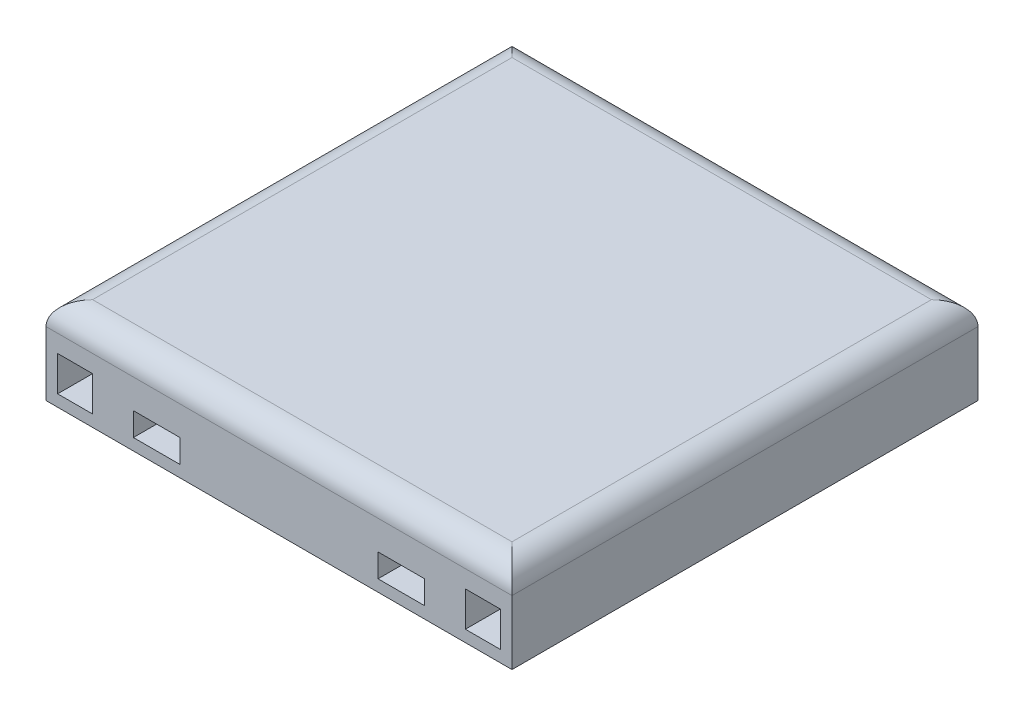
ISO-10303-21;
HEADER;
FILE_DESCRIPTION(('STEP AP214'),'2;1');
FILE_NAME('part.step','',(''),(''),'','','');
FILE_SCHEMA(('AUTOMOTIVE_DESIGN { 1 0 10303 214 1 1 1 1 }'));
ENDSEC;
DATA;
#1=APPLICATION_CONTEXT('core data for automotive mechanical design processes');
#2=APPLICATION_PROTOCOL_DEFINITION('international standard','automotive_design',2000,#1);
#3=PRODUCT_CONTEXT('',#1,'mechanical');
#4=PRODUCT('Part','Part','',(#3));
#5=PRODUCT_RELATED_PRODUCT_CATEGORY('part','',(#4));
#6=PRODUCT_DEFINITION_FORMATION('','',#4);
#7=PRODUCT_DEFINITION_CONTEXT('part definition',#1,'design');
#8=PRODUCT_DEFINITION('design','',#6,#7);
#9=PRODUCT_DEFINITION_SHAPE('','',#8);
#10=(LENGTH_UNIT() NAMED_UNIT(*) SI_UNIT(.MILLI.,.METRE.));
#11=(NAMED_UNIT(*) PLANE_ANGLE_UNIT() SI_UNIT($,.RADIAN.));
#12=(NAMED_UNIT(*) SI_UNIT($,.STERADIAN.) SOLID_ANGLE_UNIT());
#13=UNCERTAINTY_MEASURE_WITH_UNIT(LENGTH_MEASURE(1.E-05),#10,'distance_accuracy_value','');
#14=(GEOMETRIC_REPRESENTATION_CONTEXT(3) GLOBAL_UNCERTAINTY_ASSIGNED_CONTEXT((#13)) GLOBAL_UNIT_ASSIGNED_CONTEXT((#10,
#11,#12)) REPRESENTATION_CONTEXT('',''));
#15=CARTESIAN_POINT('',(0.,0.,0.));
#16=DIRECTION('',(0.,0.,1.));
#17=DIRECTION('',(1.,0.,0.));
#18=AXIS2_PLACEMENT_3D('',#15,#16,#17);
#19=CARTESIAN_POINT('',(40.,7.5,40.));
#20=DIRECTION('',(-1.,0.,0.));
#21=DIRECTION('',(0.,0.,1.));
#22=AXIS2_PLACEMENT_3D('',#19,#20,#21);
#23=PLANE('',#22);
#24=DIRECTION('',(0.,-1.,0.));
#25=VECTOR('',#24,1.);
#26=CARTESIAN_POINT('',(40.,7.5,-40.));
#27=LINE('',#26,#25);
#28=CARTESIAN_POINT('',(40.,3.5,-40.));
#29=VERTEX_POINT('',#28);
#30=CARTESIAN_POINT('',(40.,-7.5,-40.));
#31=VERTEX_POINT('',#30);
#32=EDGE_CURVE('E335',#29,#31,#27,.T.);
#33=ORIENTED_EDGE('',*,*,#32,.F.);
#34=DIRECTION('',(0.,0.,-1.));
#35=VECTOR('',#34,1.);
#36=CARTESIAN_POINT('',(40.,3.5,40.));
#37=LINE('',#36,#35);
#38=CARTESIAN_POINT('',(40.,3.5,40.));
#39=VERTEX_POINT('',#38);
#40=EDGE_CURVE('E11',#29,#39,#37,.F.);
#41=ORIENTED_EDGE('',*,*,#40,.T.);
#42=DIRECTION('',(0.,-1.,0.));
#43=VECTOR('',#42,1.);
#44=CARTESIAN_POINT('',(40.,7.5,40.));
#45=LINE('',#44,#43);
#46=CARTESIAN_POINT('',(40.,-7.5,40.));
#47=VERTEX_POINT('',#46);
#48=EDGE_CURVE('E329',#39,#47,#45,.T.);
#49=ORIENTED_EDGE('',*,*,#48,.T.);
#50=DIRECTION('',(0.,0.,-1.));
#51=VECTOR('',#50,1.);
#52=CARTESIAN_POINT('',(40.,-7.5,40.));
#53=LINE('',#52,#51);
#54=EDGE_CURVE('E317',#47,#31,#53,.T.);
#55=ORIENTED_EDGE('',*,*,#54,.T.);
#56=EDGE_LOOP('',(#33,#41,#49,#55));
#57=FACE_BOUND('',#56,.T.);
#58=ADVANCED_FACE('F34',(#57),#23,.F.);
#59=CARTESIAN_POINT('',(-40.,7.5,-40.));
#60=DIRECTION('',(0.,0.,1.));
#61=DIRECTION('',(1.,0.,0.));
#62=AXIS2_PLACEMENT_3D('',#59,#60,#61);
#63=PLANE('',#62);
#64=DIRECTION('',(0.,-1.,0.));
#65=VECTOR('',#64,1.);
#66=CARTESIAN_POINT('',(-40.,7.5,-40.));
#67=LINE('',#66,#65);
#68=CARTESIAN_POINT('',(-40.,3.5,-40.));
#69=VERTEX_POINT('',#68);
#70=CARTESIAN_POINT('',(-40.,-7.5,-40.));
#71=VERTEX_POINT('',#70);
#72=EDGE_CURVE('E333',#69,#71,#67,.T.);
#73=ORIENTED_EDGE('',*,*,#72,.F.);
#74=DIRECTION('',(-1.,0.,0.));
#75=VECTOR('',#74,1.);
#76=CARTESIAN_POINT('',(-40.,3.5,-40.));
#77=LINE('',#76,#75);
#78=EDGE_CURVE('E43',#69,#29,#77,.F.);
#79=ORIENTED_EDGE('',*,*,#78,.T.);
#80=ORIENTED_EDGE('',*,*,#32,.T.);
#81=DIRECTION('',(-1.,0.,0.));
#82=VECTOR('',#81,1.);
#83=CARTESIAN_POINT('',(-40.,-7.5,-40.));
#84=LINE('',#83,#82);
#85=EDGE_CURVE('E320',#31,#71,#84,.T.);
#86=ORIENTED_EDGE('',*,*,#85,.T.);
#87=EDGE_LOOP('',(#73,#79,#80,#86));
#88=FACE_BOUND('',#87,.T.);
#89=ADVANCED_FACE('F373',(#88),#63,.F.);
#90=CARTESIAN_POINT('',(-40.,7.5,40.));
#91=DIRECTION('',(1.,0.,0.));
#92=DIRECTION('',(0.,0.,-1.));
#93=AXIS2_PLACEMENT_3D('',#90,#91,#92);
#94=PLANE('',#93);
#95=DIRECTION('',(0.,-1.,0.));
#96=VECTOR('',#95,1.);
#97=CARTESIAN_POINT('',(-40.,7.5,40.));
#98=LINE('',#97,#96);
#99=CARTESIAN_POINT('',(-40.,3.5,40.));
#100=VERTEX_POINT('',#99);
#101=CARTESIAN_POINT('',(-40.,-7.5,40.));
#102=VERTEX_POINT('',#101);
#103=EDGE_CURVE('E331',#100,#102,#98,.T.);
#104=ORIENTED_EDGE('',*,*,#103,.F.);
#105=DIRECTION('',(0.,0.,1.));
#106=VECTOR('',#105,1.);
#107=CARTESIAN_POINT('',(-40.,3.5,40.));
#108=LINE('',#107,#106);
#109=EDGE_CURVE('E349',#100,#69,#108,.F.);
#110=ORIENTED_EDGE('',*,*,#109,.T.);
#111=ORIENTED_EDGE('',*,*,#72,.T.);
#112=DIRECTION('',(0.,0.,1.));
#113=VECTOR('',#112,1.);
#114=CARTESIAN_POINT('',(-40.,-7.5,40.));
#115=LINE('',#114,#113);
#116=EDGE_CURVE('E323',#71,#102,#115,.T.);
#117=ORIENTED_EDGE('',*,*,#116,.T.);
#118=EDGE_LOOP('',(#104,#110,#111,#117));
#119=FACE_BOUND('',#118,.T.);
#120=ADVANCED_FACE('F384',(#119),#94,.F.);
#121=CARTESIAN_POINT('',(-40.,7.5,40.));
#122=DIRECTION('',(0.,0.,-1.));
#123=DIRECTION('',(-1.,0.,0.));
#124=AXIS2_PLACEMENT_3D('',#121,#122,#123);
#125=PLANE('',#124);
#126=DIRECTION('',(1.,0.,0.));
#127=VECTOR('',#126,1.);
#128=CARTESIAN_POINT('',(-25.,-5.5,40.));
#129=LINE('',#128,#127);
#130=CARTESIAN_POINT('',(-25.,-5.5,40.));
#131=VERTEX_POINT('',#130);
#132=CARTESIAN_POINT('',(-17.,-5.5,40.));
#133=VERTEX_POINT('',#132);
#134=EDGE_CURVE('E213',#131,#133,#129,.T.);
#135=ORIENTED_EDGE('',*,*,#134,.F.);
#136=DIRECTION('',(0.,-1.,0.));
#137=VECTOR('',#136,1.);
#138=CARTESIAN_POINT('',(-25.,-1.5,40.));
#139=LINE('',#138,#137);
#140=CARTESIAN_POINT('',(-25.,-1.5,40.));
#141=VERTEX_POINT('',#140);
#142=EDGE_CURVE('E51',#141,#131,#139,.T.);
#143=ORIENTED_EDGE('',*,*,#142,.F.);
#144=DIRECTION('',(-1.,0.,0.));
#145=VECTOR('',#144,1.);
#146=CARTESIAN_POINT('',(-25.,-1.5,40.));
#147=LINE('',#146,#145);
#148=CARTESIAN_POINT('',(-17.,-1.5,40.));
#149=VERTEX_POINT('',#148);
#150=EDGE_CURVE('E204',#149,#141,#147,.T.);
#151=ORIENTED_EDGE('',*,*,#150,.F.);
#152=DIRECTION('',(0.,1.,0.));
#153=VECTOR('',#152,1.);
#154=CARTESIAN_POINT('',(-17.,-1.5,40.));
#155=LINE('',#154,#153);
#156=EDGE_CURVE('E207',#133,#149,#155,.T.);
#157=ORIENTED_EDGE('',*,*,#156,.F.);
#158=EDGE_LOOP('',(#135,#143,#151,#157));
#159=FACE_BOUND('',#158,.T.);
#160=DIRECTION('',(0.,-1.,0.));
#161=VECTOR('',#160,1.);
#162=CARTESIAN_POINT('',(17.,-1.5,40.));
#163=LINE('',#162,#161);
#164=CARTESIAN_POINT('',(17.,-1.5,40.));
#165=VERTEX_POINT('',#164);
#166=CARTESIAN_POINT('',(17.,-5.5,40.));
#167=VERTEX_POINT('',#166);
#168=EDGE_CURVE('E239',#165,#167,#163,.T.);
#169=ORIENTED_EDGE('',*,*,#168,.F.);
#170=DIRECTION('',(-1.,0.,0.));
#171=VECTOR('',#170,1.);
#172=CARTESIAN_POINT('',(25.,-1.5,40.));
#173=LINE('',#172,#171);
#174=CARTESIAN_POINT('',(25.,-1.5,40.));
#175=VERTEX_POINT('',#174);
#176=EDGE_CURVE('E59',#175,#165,#173,.T.);
#177=ORIENTED_EDGE('',*,*,#176,.F.);
#178=DIRECTION('',(0.,1.,0.));
#179=VECTOR('',#178,1.);
#180=CARTESIAN_POINT('',(25.,-1.5,40.));
#181=LINE('',#180,#179);
#182=CARTESIAN_POINT('',(25.,-5.5,40.));
#183=VERTEX_POINT('',#182);
#184=EDGE_CURVE('E228',#183,#175,#181,.T.);
#185=ORIENTED_EDGE('',*,*,#184,.F.);
#186=DIRECTION('',(1.,0.,0.));
#187=VECTOR('',#186,1.);
#188=CARTESIAN_POINT('',(25.,-5.5,40.));
#189=LINE('',#188,#187);
#190=EDGE_CURVE('E243',#167,#183,#189,.T.);
#191=ORIENTED_EDGE('',*,*,#190,.F.);
#192=EDGE_LOOP('',(#169,#177,#185,#191));
#193=FACE_BOUND('',#192,.T.);
#194=DIRECTION('',(0.,-1.,0.));
#195=VECTOR('',#194,1.);
#196=CARTESIAN_POINT('',(32.,0.500000000000001,40.));
#197=LINE('',#196,#195);
#198=CARTESIAN_POINT('',(32.,0.5,40.));
#199=VERTEX_POINT('',#198);
#200=CARTESIAN_POINT('',(32.,-5.5,40.));
#201=VERTEX_POINT('',#200);
#202=EDGE_CURVE('E270',#199,#201,#197,.T.);
#203=ORIENTED_EDGE('',*,*,#202,.F.);
#204=DIRECTION('',(-1.,0.,0.));
#205=VECTOR('',#204,1.);
#206=CARTESIAN_POINT('',(38.,0.5,40.));
#207=LINE('',#206,#205);
#208=CARTESIAN_POINT('',(38.,0.5,40.));
#209=VERTEX_POINT('',#208);
#210=EDGE_CURVE('E268',#209,#199,#207,.T.);
#211=ORIENTED_EDGE('',*,*,#210,.F.);
#212=DIRECTION('',(0.,1.,0.));
#213=VECTOR('',#212,1.);
#214=CARTESIAN_POINT('',(38.,0.5,40.));
#215=LINE('',#214,#213);
#216=CARTESIAN_POINT('',(38.,-5.5,40.));
#217=VERTEX_POINT('',#216);
#218=EDGE_CURVE('E258',#217,#209,#215,.T.);
#219=ORIENTED_EDGE('',*,*,#218,.F.);
#220=DIRECTION('',(1.,0.,0.));
#221=VECTOR('',#220,1.);
#222=CARTESIAN_POINT('',(38.,-5.5,40.));
#223=LINE('',#222,#221);
#224=EDGE_CURVE('E273',#201,#217,#223,.T.);
#225=ORIENTED_EDGE('',*,*,#224,.F.);
#226=EDGE_LOOP('',(#203,#211,#219,#225));
#227=FACE_BOUND('',#226,.T.);
#228=DIRECTION('',(1.,0.,0.));
#229=VECTOR('',#228,1.);
#230=CARTESIAN_POINT('',(-38.,-5.5,40.));
#231=LINE('',#230,#229);
#232=CARTESIAN_POINT('',(-38.,-5.5,40.));
#233=VERTEX_POINT('',#232);
#234=CARTESIAN_POINT('',(-32.,-5.5,40.));
#235=VERTEX_POINT('',#234);
#236=EDGE_CURVE('E300',#233,#235,#231,.T.);
#237=ORIENTED_EDGE('',*,*,#236,.F.);
#238=DIRECTION('',(0.,-1.,0.));
#239=VECTOR('',#238,1.);
#240=CARTESIAN_POINT('',(-38.,0.5,40.));
#241=LINE('',#240,#239);
#242=CARTESIAN_POINT('',(-38.,0.5,40.));
#243=VERTEX_POINT('',#242);
#244=EDGE_CURVE('E220',#243,#233,#241,.T.);
#245=ORIENTED_EDGE('',*,*,#244,.F.);
#246=DIRECTION('',(-1.,0.,0.));
#247=VECTOR('',#246,1.);
#248=CARTESIAN_POINT('',(-38.,0.5,40.));
#249=LINE('',#248,#247);
#250=CARTESIAN_POINT('',(-32.,0.500000000000001,40.));
#251=VERTEX_POINT('',#250);
#252=EDGE_CURVE('E289',#251,#243,#249,.T.);
#253=ORIENTED_EDGE('',*,*,#252,.F.);
#254=DIRECTION('',(0.,1.,0.));
#255=VECTOR('',#254,1.);
#256=CARTESIAN_POINT('',(-32.,0.500000000000001,40.));
#257=LINE('',#256,#255);
#258=EDGE_CURVE('E303',#235,#251,#257,.T.);
#259=ORIENTED_EDGE('',*,*,#258,.F.);
#260=EDGE_LOOP('',(#237,#245,#253,#259));
#261=FACE_BOUND('',#260,.T.);
#262=ORIENTED_EDGE('',*,*,#48,.F.);
#263=DIRECTION('',(1.,0.,0.));
#264=VECTOR('',#263,1.);
#265=CARTESIAN_POINT('',(-40.,3.5,40.));
#266=LINE('',#265,#264);
#267=EDGE_CURVE('E346',#39,#100,#266,.F.);
#268=ORIENTED_EDGE('',*,*,#267,.T.);
#269=ORIENTED_EDGE('',*,*,#103,.T.);
#270=DIRECTION('',(1.,0.,0.));
#271=VECTOR('',#270,1.);
#272=CARTESIAN_POINT('',(-40.,-7.5,40.));
#273=LINE('',#272,#271);
#274=EDGE_CURVE('E326',#102,#47,#273,.T.);
#275=ORIENTED_EDGE('',*,*,#274,.T.);
#276=EDGE_LOOP('',(#262,#268,#269,#275));
#277=FACE_BOUND('',#276,.T.);
#278=ADVANCED_FACE('F386',(#159,#193,#227,#261,#277),#125,.F.);
#279=CARTESIAN_POINT('',(0.,7.5,0.));
#280=DIRECTION('',(0.,-1.,0.));
#281=DIRECTION('',(0.,0.,-1.));
#282=AXIS2_PLACEMENT_3D('',#279,#280,#281);
#283=PLANE('',#282);
#284=DIRECTION('',(0.,0.,1.));
#285=VECTOR('',#284,1.);
#286=CARTESIAN_POINT('',(-36.,7.5,0.));
#287=LINE('',#286,#285);
#288=CARTESIAN_POINT('',(-36.,7.5,-36.));
#289=VERTEX_POINT('',#288);
#290=CARTESIAN_POINT('',(-36.,7.5,36.));
#291=VERTEX_POINT('',#290);
#292=EDGE_CURVE('E341',#289,#291,#287,.T.);
#293=ORIENTED_EDGE('',*,*,#292,.T.);
#294=DIRECTION('',(1.,0.,0.));
#295=VECTOR('',#294,1.);
#296=CARTESIAN_POINT('',(0.,7.5,36.));
#297=LINE('',#296,#295);
#298=CARTESIAN_POINT('',(36.,7.5,36.));
#299=VERTEX_POINT('',#298);
#300=EDGE_CURVE('E343',#291,#299,#297,.T.);
#301=ORIENTED_EDGE('',*,*,#300,.T.);
#302=DIRECTION('',(0.,0.,-1.));
#303=VECTOR('',#302,1.);
#304=CARTESIAN_POINT('',(36.,7.5,0.));
#305=LINE('',#304,#303);
#306=CARTESIAN_POINT('',(36.,7.5,-36.));
#307=VERTEX_POINT('',#306);
#308=EDGE_CURVE('E337',#299,#307,#305,.T.);
#309=ORIENTED_EDGE('',*,*,#308,.T.);
#310=DIRECTION('',(-1.,0.,0.));
#311=VECTOR('',#310,1.);
#312=CARTESIAN_POINT('',(0.,7.5,-36.));
#313=LINE('',#312,#311);
#314=EDGE_CURVE('E339',#307,#289,#313,.T.);
#315=ORIENTED_EDGE('',*,*,#314,.T.);
#316=EDGE_LOOP('',(#293,#301,#309,#315));
#317=FACE_BOUND('',#316,.T.);
#318=ADVANCED_FACE('F394',(#317),#283,.F.);
#319=CARTESIAN_POINT('',(0.,-7.5,0.));
#320=DIRECTION('',(0.,-1.,0.));
#321=DIRECTION('',(0.,0.,-1.));
#322=AXIS2_PLACEMENT_3D('',#319,#320,#321);
#323=PLANE('',#322);
#324=ORIENTED_EDGE('',*,*,#54,.F.);
#325=ORIENTED_EDGE('',*,*,#274,.F.);
#326=ORIENTED_EDGE('',*,*,#116,.F.);
#327=ORIENTED_EDGE('',*,*,#85,.F.);
#328=EDGE_LOOP('',(#324,#325,#326,#327));
#329=FACE_BOUND('',#328,.T.);
#330=ADVANCED_FACE('F380',(#329),#323,.T.);
#331=CARTESIAN_POINT('',(0.,3.5,-36.));
#332=DIRECTION('',(-1.,0.,0.));
#333=DIRECTION('',(0.,0.,1.));
#334=AXIS2_PLACEMENT_3D('',#331,#332,#333);
#335=CYLINDRICAL_SURFACE('',#334,4.);
#336=CARTESIAN_POINT('',(36.,3.5,-36.));
#337=DIRECTION('',(-0.707106781186547,0.,-0.707106781186547));
#338=DIRECTION('',(0.707106781186547,0.,-0.707106781186547));
#339=AXIS2_PLACEMENT_3D('',#336,#337,#338);
#340=ELLIPSE('',#339,5.65685424949238,4.);
#341=EDGE_CURVE('E354',#29,#307,#340,.F.);
#342=ORIENTED_EDGE('',*,*,#341,.F.);
#343=ORIENTED_EDGE('',*,*,#78,.F.);
#344=CARTESIAN_POINT('',(-36.,3.5,-36.));
#345=DIRECTION('',(-0.707106781186547,0.,0.707106781186547));
#346=DIRECTION('',(-0.707106781186547,0.,-0.707106781186547));
#347=AXIS2_PLACEMENT_3D('',#344,#345,#346);
#348=ELLIPSE('',#347,5.65685424949238,4.);
#349=EDGE_CURVE('E38',#289,#69,#348,.T.);
#350=ORIENTED_EDGE('',*,*,#349,.F.);
#351=ORIENTED_EDGE('',*,*,#314,.F.);
#352=EDGE_LOOP('',(#342,#343,#350,#351));
#353=FACE_BOUND('',#352,.T.);
#354=ADVANCED_FACE('F36',(#353),#335,.T.);
#355=CARTESIAN_POINT('',(-36.,3.5,0.));
#356=DIRECTION('',(0.,0.,1.));
#357=DIRECTION('',(1.,0.,0.));
#358=AXIS2_PLACEMENT_3D('',#355,#356,#357);
#359=CYLINDRICAL_SURFACE('',#358,4.);
#360=ORIENTED_EDGE('',*,*,#349,.T.);
#361=ORIENTED_EDGE('',*,*,#109,.F.);
#362=CARTESIAN_POINT('',(-36.,3.5,36.));
#363=DIRECTION('',(0.707106781186547,0.,0.707106781186547));
#364=DIRECTION('',(-0.707106781186547,0.,0.707106781186547));
#365=AXIS2_PLACEMENT_3D('',#362,#363,#364);
#366=ELLIPSE('',#365,5.65685424949238,4.);
#367=EDGE_CURVE('E353',#291,#100,#366,.T.);
#368=ORIENTED_EDGE('',*,*,#367,.F.);
#369=ORIENTED_EDGE('',*,*,#292,.F.);
#370=EDGE_LOOP('',(#360,#361,#368,#369));
#371=FACE_BOUND('',#370,.T.);
#372=ADVANCED_FACE('F365',(#371),#359,.T.);
#373=CARTESIAN_POINT('',(36.,3.5,0.));
#374=DIRECTION('',(0.,0.,-1.));
#375=DIRECTION('',(-1.,0.,0.));
#376=AXIS2_PLACEMENT_3D('',#373,#374,#375);
#377=CYLINDRICAL_SURFACE('',#376,4.);
#378=ORIENTED_EDGE('',*,*,#341,.T.);
#379=ORIENTED_EDGE('',*,*,#308,.F.);
#380=CARTESIAN_POINT('',(36.,3.5,36.));
#381=DIRECTION('',(0.707106781186547,0.,-0.707106781186547));
#382=DIRECTION('',(-0.707106781186547,0.,-0.707106781186547));
#383=AXIS2_PLACEMENT_3D('',#380,#381,#382);
#384=ELLIPSE('',#383,5.65685424949238,4.);
#385=EDGE_CURVE('E310',#39,#299,#384,.F.);
#386=ORIENTED_EDGE('',*,*,#385,.F.);
#387=ORIENTED_EDGE('',*,*,#40,.F.);
#388=EDGE_LOOP('',(#378,#379,#386,#387));
#389=FACE_BOUND('',#388,.T.);
#390=ADVANCED_FACE('F392',(#389),#377,.T.);
#391=CARTESIAN_POINT('',(0.,3.5,36.));
#392=DIRECTION('',(1.,0.,0.));
#393=DIRECTION('',(0.,0.,-1.));
#394=AXIS2_PLACEMENT_3D('',#391,#392,#393);
#395=CYLINDRICAL_SURFACE('',#394,4.);
#396=ORIENTED_EDGE('',*,*,#367,.T.);
#397=ORIENTED_EDGE('',*,*,#267,.F.);
#398=ORIENTED_EDGE('',*,*,#385,.T.);
#399=ORIENTED_EDGE('',*,*,#300,.F.);
#400=EDGE_LOOP('',(#396,#397,#398,#399));
#401=FACE_BOUND('',#400,.T.);
#402=ADVANCED_FACE('F390',(#401),#395,.T.);
#403=CARTESIAN_POINT('',(-38.,0.5,32.));
#404=DIRECTION('',(-1.,0.,0.));
#405=DIRECTION('',(0.,0.,1.));
#406=AXIS2_PLACEMENT_3D('',#403,#404,#405);
#407=PLANE('',#406);
#408=ORIENTED_EDGE('',*,*,#244,.T.);
#409=DIRECTION('',(0.,0.,1.));
#410=VECTOR('',#409,1.);
#411=CARTESIAN_POINT('',(-38.,-5.5,32.));
#412=LINE('',#411,#410);
#413=CARTESIAN_POINT('',(-38.,-5.5,32.));
#414=VERTEX_POINT('',#413);
#415=EDGE_CURVE('E298',#414,#233,#412,.T.);
#416=ORIENTED_EDGE('',*,*,#415,.F.);
#417=DIRECTION('',(0.,-1.,0.));
#418=VECTOR('',#417,1.);
#419=CARTESIAN_POINT('',(-38.,0.5,32.));
#420=LINE('',#419,#418);
#421=CARTESIAN_POINT('',(-38.,0.5,32.));
#422=VERTEX_POINT('',#421);
#423=EDGE_CURVE('E285',#422,#414,#420,.T.);
#424=ORIENTED_EDGE('',*,*,#423,.F.);
#425=DIRECTION('',(0.,0.,1.));
#426=VECTOR('',#425,1.);
#427=CARTESIAN_POINT('',(-38.,0.5,32.));
#428=LINE('',#427,#426);
#429=EDGE_CURVE('E308',#422,#243,#428,.T.);
#430=ORIENTED_EDGE('',*,*,#429,.T.);
#431=EDGE_LOOP('',(#408,#416,#424,#430));
#432=FACE_BOUND('',#431,.T.);
#433=ADVANCED_FACE('F415',(#432),#407,.F.);
#434=CARTESIAN_POINT('',(-38.,0.5,32.));
#435=DIRECTION('',(0.,1.,0.));
#436=DIRECTION('',(-1.,0.,0.));
#437=AXIS2_PLACEMENT_3D('',#434,#435,#436);
#438=PLANE('',#437);
#439=ORIENTED_EDGE('',*,*,#252,.T.);
#440=ORIENTED_EDGE('',*,*,#429,.F.);
#441=DIRECTION('',(-1.,0.,0.));
#442=VECTOR('',#441,1.);
#443=CARTESIAN_POINT('',(-38.,0.5,32.));
#444=LINE('',#443,#442);
#445=CARTESIAN_POINT('',(-32.,0.500000000000001,32.));
#446=VERTEX_POINT('',#445);
#447=EDGE_CURVE('E295',#446,#422,#444,.T.);
#448=ORIENTED_EDGE('',*,*,#447,.F.);
#449=DIRECTION('',(0.,0.,1.));
#450=VECTOR('',#449,1.);
#451=CARTESIAN_POINT('',(-32.,0.500000000000001,32.));
#452=LINE('',#451,#450);
#453=EDGE_CURVE('E311',#446,#251,#452,.T.);
#454=ORIENTED_EDGE('',*,*,#453,.T.);
#455=EDGE_LOOP('',(#439,#440,#448,#454));
#456=FACE_BOUND('',#455,.T.);
#457=ADVANCED_FACE('F467',(#456),#438,.F.);
#458=CARTESIAN_POINT('',(-32.,0.500000000000001,32.));
#459=DIRECTION('',(1.,0.,0.));
#460=DIRECTION('',(0.,0.,-1.));
#461=AXIS2_PLACEMENT_3D('',#458,#459,#460);
#462=PLANE('',#461);
#463=ORIENTED_EDGE('',*,*,#258,.T.);
#464=ORIENTED_EDGE('',*,*,#453,.F.);
#465=DIRECTION('',(0.,1.,0.));
#466=VECTOR('',#465,1.);
#467=CARTESIAN_POINT('',(-32.,0.500000000000001,32.));
#468=LINE('',#467,#466);
#469=CARTESIAN_POINT('',(-32.,-5.5,32.));
#470=VERTEX_POINT('',#469);
#471=EDGE_CURVE('E292',#470,#446,#468,.T.);
#472=ORIENTED_EDGE('',*,*,#471,.F.);
#473=DIRECTION('',(0.,0.,1.));
#474=VECTOR('',#473,1.);
#475=CARTESIAN_POINT('',(-32.,-5.5,32.));
#476=LINE('',#475,#474);
#477=EDGE_CURVE('E313',#470,#235,#476,.T.);
#478=ORIENTED_EDGE('',*,*,#477,.T.);
#479=EDGE_LOOP('',(#463,#464,#472,#478));
#480=FACE_BOUND('',#479,.T.);
#481=ADVANCED_FACE('F476',(#480),#462,.F.);
#482=CARTESIAN_POINT('',(-38.,-5.5,32.));
#483=DIRECTION('',(0.,-1.,0.));
#484=DIRECTION('',(0.,0.,-1.));
#485=AXIS2_PLACEMENT_3D('',#482,#483,#484);
#486=PLANE('',#485);
#487=ORIENTED_EDGE('',*,*,#236,.T.);
#488=ORIENTED_EDGE('',*,*,#477,.F.);
#489=DIRECTION('',(1.,0.,0.));
#490=VECTOR('',#489,1.);
#491=CARTESIAN_POINT('',(-38.,-5.5,32.));
#492=LINE('',#491,#490);
#493=EDGE_CURVE('E288',#414,#470,#492,.T.);
#494=ORIENTED_EDGE('',*,*,#493,.F.);
#495=ORIENTED_EDGE('',*,*,#415,.T.);
#496=EDGE_LOOP('',(#487,#488,#494,#495));
#497=FACE_BOUND('',#496,.T.);
#498=ADVANCED_FACE('F486',(#497),#486,.F.);
#499=CARTESIAN_POINT('',(0.,0.,32.));
#500=DIRECTION('',(0.,0.,1.));
#501=DIRECTION('',(1.,0.,0.));
#502=AXIS2_PLACEMENT_3D('',#499,#500,#501);
#503=PLANE('',#502);
#504=ORIENTED_EDGE('',*,*,#423,.T.);
#505=ORIENTED_EDGE('',*,*,#493,.T.);
#506=ORIENTED_EDGE('',*,*,#471,.T.);
#507=ORIENTED_EDGE('',*,*,#447,.T.);
#508=EDGE_LOOP('',(#504,#505,#506,#507));
#509=FACE_BOUND('',#508,.T.);
#510=ADVANCED_FACE('F496',(#509),#503,.T.);
#511=CARTESIAN_POINT('',(38.,0.5,32.));
#512=DIRECTION('',(0.,1.,0.));
#513=DIRECTION('',(-1.,0.,0.));
#514=AXIS2_PLACEMENT_3D('',#511,#512,#513);
#515=PLANE('',#514);
#516=ORIENTED_EDGE('',*,*,#210,.T.);
#517=DIRECTION('',(0.,0.,1.));
#518=VECTOR('',#517,1.);
#519=CARTESIAN_POINT('',(32.,0.500000000000001,32.));
#520=LINE('',#519,#518);
#521=CARTESIAN_POINT('',(32.,0.500000000000001,32.));
#522=VERTEX_POINT('',#521);
#523=EDGE_CURVE('E267',#522,#199,#520,.T.);
#524=ORIENTED_EDGE('',*,*,#523,.F.);
#525=DIRECTION('',(-1.,0.,0.));
#526=VECTOR('',#525,1.);
#527=CARTESIAN_POINT('',(38.,0.5,32.));
#528=LINE('',#527,#526);
#529=CARTESIAN_POINT('',(38.,0.5,32.));
#530=VERTEX_POINT('',#529);
#531=EDGE_CURVE('E254',#530,#522,#528,.T.);
#532=ORIENTED_EDGE('',*,*,#531,.F.);
#533=DIRECTION('',(0.,0.,1.));
#534=VECTOR('',#533,1.);
#535=CARTESIAN_POINT('',(38.,0.5,32.));
#536=LINE('',#535,#534);
#537=EDGE_CURVE('E240',#530,#209,#536,.T.);
#538=ORIENTED_EDGE('',*,*,#537,.T.);
#539=EDGE_LOOP('',(#516,#524,#532,#538));
#540=FACE_BOUND('',#539,.T.);
#541=ADVANCED_FACE('F506',(#540),#515,.F.);
#542=CARTESIAN_POINT('',(38.,0.5,32.));
#543=DIRECTION('',(1.,0.,0.));
#544=DIRECTION('',(0.,0.,-1.));
#545=AXIS2_PLACEMENT_3D('',#542,#543,#544);
#546=PLANE('',#545);
#547=ORIENTED_EDGE('',*,*,#218,.T.);
#548=ORIENTED_EDGE('',*,*,#537,.F.);
#549=DIRECTION('',(0.,1.,0.));
#550=VECTOR('',#549,1.);
#551=CARTESIAN_POINT('',(38.,0.5,32.));
#552=LINE('',#551,#550);
#553=CARTESIAN_POINT('',(38.,-5.5,32.));
#554=VERTEX_POINT('',#553);
#555=EDGE_CURVE('E264',#554,#530,#552,.T.);
#556=ORIENTED_EDGE('',*,*,#555,.F.);
#557=DIRECTION('',(0.,0.,1.));
#558=VECTOR('',#557,1.);
#559=CARTESIAN_POINT('',(38.,-5.5,32.));
#560=LINE('',#559,#558);
#561=EDGE_CURVE('E279',#554,#217,#560,.T.);
#562=ORIENTED_EDGE('',*,*,#561,.T.);
#563=EDGE_LOOP('',(#547,#548,#556,#562));
#564=FACE_BOUND('',#563,.T.);
#565=ADVANCED_FACE('F516',(#564),#546,.F.);
#566=CARTESIAN_POINT('',(38.,-5.5,32.));
#567=DIRECTION('',(0.,-1.,0.));
#568=DIRECTION('',(0.,0.,-1.));
#569=AXIS2_PLACEMENT_3D('',#566,#567,#568);
#570=PLANE('',#569);
#571=ORIENTED_EDGE('',*,*,#224,.T.);
#572=ORIENTED_EDGE('',*,*,#561,.F.);
#573=DIRECTION('',(1.,0.,0.));
#574=VECTOR('',#573,1.);
#575=CARTESIAN_POINT('',(38.,-5.5,32.));
#576=LINE('',#575,#574);
#577=CARTESIAN_POINT('',(32.,-5.5,32.));
#578=VERTEX_POINT('',#577);
#579=EDGE_CURVE('E261',#578,#554,#576,.T.);
#580=ORIENTED_EDGE('',*,*,#579,.F.);
#581=DIRECTION('',(0.,0.,1.));
#582=VECTOR('',#581,1.);
#583=CARTESIAN_POINT('',(32.,-5.5,32.));
#584=LINE('',#583,#582);
#585=EDGE_CURVE('E281',#578,#201,#584,.T.);
#586=ORIENTED_EDGE('',*,*,#585,.T.);
#587=EDGE_LOOP('',(#571,#572,#580,#586));
#588=FACE_BOUND('',#587,.T.);
#589=ADVANCED_FACE('F526',(#588),#570,.F.);
#590=CARTESIAN_POINT('',(32.,0.500000000000001,32.));
#591=DIRECTION('',(-1.,0.,0.));
#592=DIRECTION('',(0.,0.,1.));
#593=AXIS2_PLACEMENT_3D('',#590,#591,#592);
#594=PLANE('',#593);
#595=ORIENTED_EDGE('',*,*,#202,.T.);
#596=ORIENTED_EDGE('',*,*,#585,.F.);
#597=DIRECTION('',(0.,-1.,0.));
#598=VECTOR('',#597,1.);
#599=CARTESIAN_POINT('',(32.,0.500000000000001,32.));
#600=LINE('',#599,#598);
#601=EDGE_CURVE('E257',#522,#578,#600,.T.);
#602=ORIENTED_EDGE('',*,*,#601,.F.);
#603=ORIENTED_EDGE('',*,*,#523,.T.);
#604=EDGE_LOOP('',(#595,#596,#602,#603));
#605=FACE_BOUND('',#604,.T.);
#606=ADVANCED_FACE('F536',(#605),#594,.F.);
#607=CARTESIAN_POINT('',(0.,0.,32.));
#608=DIRECTION('',(0.,0.,1.));
#609=DIRECTION('',(1.,0.,0.));
#610=AXIS2_PLACEMENT_3D('',#607,#608,#609);
#611=PLANE('',#610);
#612=ORIENTED_EDGE('',*,*,#531,.T.);
#613=ORIENTED_EDGE('',*,*,#601,.T.);
#614=ORIENTED_EDGE('',*,*,#579,.T.);
#615=ORIENTED_EDGE('',*,*,#555,.T.);
#616=EDGE_LOOP('',(#612,#613,#614,#615));
#617=FACE_BOUND('',#616,.T.);
#618=ADVANCED_FACE('F546',(#617),#611,.T.);
#619=CARTESIAN_POINT('',(25.,-1.5,32.));
#620=DIRECTION('',(0.,1.,0.));
#621=DIRECTION('',(0.,0.,1.));
#622=AXIS2_PLACEMENT_3D('',#619,#620,#621);
#623=PLANE('',#622);
#624=ORIENTED_EDGE('',*,*,#176,.T.);
#625=DIRECTION('',(0.,0.,1.));
#626=VECTOR('',#625,1.);
#627=CARTESIAN_POINT('',(17.,-1.5,32.));
#628=LINE('',#627,#626);
#629=CARTESIAN_POINT('',(17.,-1.5,32.));
#630=VERTEX_POINT('',#629);
#631=EDGE_CURVE('E237',#630,#165,#628,.T.);
#632=ORIENTED_EDGE('',*,*,#631,.F.);
#633=DIRECTION('',(-1.,0.,0.));
#634=VECTOR('',#633,1.);
#635=CARTESIAN_POINT('',(25.,-1.5,32.));
#636=LINE('',#635,#634);
#637=CARTESIAN_POINT('',(25.,-1.5,32.));
#638=VERTEX_POINT('',#637);
#639=EDGE_CURVE('E224',#638,#630,#636,.T.);
#640=ORIENTED_EDGE('',*,*,#639,.F.);
#641=DIRECTION('',(0.,0.,1.));
#642=VECTOR('',#641,1.);
#643=CARTESIAN_POINT('',(25.,-1.5,32.));
#644=LINE('',#643,#642);
#645=EDGE_CURVE('E214',#638,#175,#644,.T.);
#646=ORIENTED_EDGE('',*,*,#645,.T.);
#647=EDGE_LOOP('',(#624,#632,#640,#646));
#648=FACE_BOUND('',#647,.T.);
#649=ADVANCED_FACE('F556',(#648),#623,.F.);
#650=CARTESIAN_POINT('',(25.,-1.5,32.));
#651=DIRECTION('',(1.,0.,0.));
#652=DIRECTION('',(0.,0.,-1.));
#653=AXIS2_PLACEMENT_3D('',#650,#651,#652);
#654=PLANE('',#653);
#655=ORIENTED_EDGE('',*,*,#184,.T.);
#656=ORIENTED_EDGE('',*,*,#645,.F.);
#657=DIRECTION('',(0.,1.,0.));
#658=VECTOR('',#657,1.);
#659=CARTESIAN_POINT('',(25.,-1.5,32.));
#660=LINE('',#659,#658);
#661=CARTESIAN_POINT('',(25.,-5.5,32.));
#662=VERTEX_POINT('',#661);
#663=EDGE_CURVE('E234',#662,#638,#660,.T.);
#664=ORIENTED_EDGE('',*,*,#663,.F.);
#665=DIRECTION('',(0.,0.,1.));
#666=VECTOR('',#665,1.);
#667=CARTESIAN_POINT('',(25.,-5.5,32.));
#668=LINE('',#667,#666);
#669=EDGE_CURVE('E249',#662,#183,#668,.T.);
#670=ORIENTED_EDGE('',*,*,#669,.T.);
#671=EDGE_LOOP('',(#655,#656,#664,#670));
#672=FACE_BOUND('',#671,.T.);
#673=ADVANCED_FACE('F566',(#672),#654,.F.);
#674=CARTESIAN_POINT('',(25.,-5.5,32.));
#675=DIRECTION('',(0.,-1.,0.));
#676=DIRECTION('',(0.,0.,-1.));
#677=AXIS2_PLACEMENT_3D('',#674,#675,#676);
#678=PLANE('',#677);
#679=ORIENTED_EDGE('',*,*,#190,.T.);
#680=ORIENTED_EDGE('',*,*,#669,.F.);
#681=DIRECTION('',(1.,0.,0.));
#682=VECTOR('',#681,1.);
#683=CARTESIAN_POINT('',(25.,-5.5,32.));
#684=LINE('',#683,#682);
#685=CARTESIAN_POINT('',(17.,-5.5,32.));
#686=VERTEX_POINT('',#685);
#687=EDGE_CURVE('E231',#686,#662,#684,.T.);
#688=ORIENTED_EDGE('',*,*,#687,.F.);
#689=DIRECTION('',(0.,0.,1.));
#690=VECTOR('',#689,1.);
#691=CARTESIAN_POINT('',(17.,-5.5,32.));
#692=LINE('',#691,#690);
#693=EDGE_CURVE('E251',#686,#167,#692,.T.);
#694=ORIENTED_EDGE('',*,*,#693,.T.);
#695=EDGE_LOOP('',(#679,#680,#688,#694));
#696=FACE_BOUND('',#695,.T.);
#697=ADVANCED_FACE('F575',(#696),#678,.F.);
#698=CARTESIAN_POINT('',(17.,-1.5,32.));
#699=DIRECTION('',(-1.,0.,0.));
#700=DIRECTION('',(0.,0.,1.));
#701=AXIS2_PLACEMENT_3D('',#698,#699,#700);
#702=PLANE('',#701);
#703=ORIENTED_EDGE('',*,*,#168,.T.);
#704=ORIENTED_EDGE('',*,*,#693,.F.);
#705=DIRECTION('',(0.,-1.,0.));
#706=VECTOR('',#705,1.);
#707=CARTESIAN_POINT('',(17.,-1.5,32.));
#708=LINE('',#707,#706);
#709=EDGE_CURVE('E227',#630,#686,#708,.T.);
#710=ORIENTED_EDGE('',*,*,#709,.F.);
#711=ORIENTED_EDGE('',*,*,#631,.T.);
#712=EDGE_LOOP('',(#703,#704,#710,#711));
#713=FACE_BOUND('',#712,.T.);
#714=ADVANCED_FACE('F585',(#713),#702,.F.);
#715=CARTESIAN_POINT('',(0.,0.,32.));
#716=DIRECTION('',(0.,0.,1.));
#717=DIRECTION('',(1.,0.,0.));
#718=AXIS2_PLACEMENT_3D('',#715,#716,#717);
#719=PLANE('',#718);
#720=ORIENTED_EDGE('',*,*,#639,.T.);
#721=ORIENTED_EDGE('',*,*,#709,.T.);
#722=ORIENTED_EDGE('',*,*,#687,.T.);
#723=ORIENTED_EDGE('',*,*,#663,.T.);
#724=EDGE_LOOP('',(#720,#721,#722,#723));
#725=FACE_BOUND('',#724,.T.);
#726=ADVANCED_FACE('F595',(#725),#719,.T.);
#727=CARTESIAN_POINT('',(-25.,-1.5,32.));
#728=DIRECTION('',(-1.,0.,0.));
#729=DIRECTION('',(0.,0.,1.));
#730=AXIS2_PLACEMENT_3D('',#727,#728,#729);
#731=PLANE('',#730);
#732=ORIENTED_EDGE('',*,*,#142,.T.);
#733=DIRECTION('',(0.,0.,1.));
#734=VECTOR('',#733,1.);
#735=CARTESIAN_POINT('',(-25.,-5.5,32.));
#736=LINE('',#735,#734);
#737=CARTESIAN_POINT('',(-25.,-5.5,32.));
#738=VERTEX_POINT('',#737);
#739=EDGE_CURVE('E182',#738,#131,#736,.T.);
#740=ORIENTED_EDGE('',*,*,#739,.F.);
#741=DIRECTION('',(0.,-1.,0.));
#742=VECTOR('',#741,1.);
#743=CARTESIAN_POINT('',(-25.,-1.5,32.));
#744=LINE('',#743,#742);
#745=CARTESIAN_POINT('',(-25.,-1.5,32.));
#746=VERTEX_POINT('',#745);
#747=EDGE_CURVE('E186',#746,#738,#744,.T.);
#748=ORIENTED_EDGE('',*,*,#747,.F.);
#749=DIRECTION('',(0.,0.,1.));
#750=VECTOR('',#749,1.);
#751=CARTESIAN_POINT('',(-25.,-1.5,32.));
#752=LINE('',#751,#750);
#753=EDGE_CURVE('E218',#746,#141,#752,.T.);
#754=ORIENTED_EDGE('',*,*,#753,.T.);
#755=EDGE_LOOP('',(#732,#740,#748,#754));
#756=FACE_BOUND('',#755,.T.);
#757=ADVANCED_FACE('F184',(#756),#731,.F.);
#758=CARTESIAN_POINT('',(-25.,-1.5,32.));
#759=DIRECTION('',(0.,1.,0.));
#760=DIRECTION('',(0.,0.,1.));
#761=AXIS2_PLACEMENT_3D('',#758,#759,#760);
#762=PLANE('',#761);
#763=ORIENTED_EDGE('',*,*,#150,.T.);
#764=ORIENTED_EDGE('',*,*,#753,.F.);
#765=DIRECTION('',(-1.,0.,0.));
#766=VECTOR('',#765,1.);
#767=CARTESIAN_POINT('',(-25.,-1.5,32.));
#768=LINE('',#767,#766);
#769=CARTESIAN_POINT('',(-17.,-1.5,32.));
#770=VERTEX_POINT('',#769);
#771=EDGE_CURVE('E192',#770,#746,#768,.T.);
#772=ORIENTED_EDGE('',*,*,#771,.F.);
#773=DIRECTION('',(0.,0.,1.));
#774=VECTOR('',#773,1.);
#775=CARTESIAN_POINT('',(-17.,-1.5,32.));
#776=LINE('',#775,#774);
#777=EDGE_CURVE('E221',#770,#149,#776,.T.);
#778=ORIENTED_EDGE('',*,*,#777,.T.);
#779=EDGE_LOOP('',(#763,#764,#772,#778));
#780=FACE_BOUND('',#779,.T.);
#781=ADVANCED_FACE('F614',(#780),#762,.F.);
#782=CARTESIAN_POINT('',(-17.,-1.5,32.));
#783=DIRECTION('',(1.,0.,0.));
#784=DIRECTION('',(0.,0.,-1.));
#785=AXIS2_PLACEMENT_3D('',#782,#783,#784);
#786=PLANE('',#785);
#787=ORIENTED_EDGE('',*,*,#156,.T.);
#788=ORIENTED_EDGE('',*,*,#777,.F.);
#789=DIRECTION('',(0.,1.,0.));
#790=VECTOR('',#789,1.);
#791=CARTESIAN_POINT('',(-17.,-1.5,32.));
#792=LINE('',#791,#790);
#793=CARTESIAN_POINT('',(-17.,-5.5,32.));
#794=VERTEX_POINT('',#793);
#795=EDGE_CURVE('E200',#794,#770,#792,.T.);
#796=ORIENTED_EDGE('',*,*,#795,.F.);
#797=DIRECTION('',(0.,0.,1.));
#798=VECTOR('',#797,1.);
#799=CARTESIAN_POINT('',(-17.,-5.5,32.));
#800=LINE('',#799,#798);
#801=EDGE_CURVE('E191',#794,#133,#800,.T.);
#802=ORIENTED_EDGE('',*,*,#801,.T.);
#803=EDGE_LOOP('',(#787,#788,#796,#802));
#804=FACE_BOUND('',#803,.T.);
#805=ADVANCED_FACE('F623',(#804),#786,.F.);
#806=CARTESIAN_POINT('',(-25.,-5.5,32.));
#807=DIRECTION('',(0.,-1.,0.));
#808=DIRECTION('',(0.,0.,-1.));
#809=AXIS2_PLACEMENT_3D('',#806,#807,#808);
#810=PLANE('',#809);
#811=ORIENTED_EDGE('',*,*,#134,.T.);
#812=ORIENTED_EDGE('',*,*,#801,.F.);
#813=DIRECTION('',(1.,0.,0.));
#814=VECTOR('',#813,1.);
#815=CARTESIAN_POINT('',(-25.,-5.5,32.));
#816=LINE('',#815,#814);
#817=EDGE_CURVE('E195',#738,#794,#816,.T.);
#818=ORIENTED_EDGE('',*,*,#817,.F.);
#819=ORIENTED_EDGE('',*,*,#739,.T.);
#820=EDGE_LOOP('',(#811,#812,#818,#819));
#821=FACE_BOUND('',#820,.T.);
#822=ADVANCED_FACE('F196',(#821),#810,.F.);
#823=CARTESIAN_POINT('',(0.,0.,32.));
#824=DIRECTION('',(0.,0.,1.));
#825=DIRECTION('',(1.,0.,0.));
#826=AXIS2_PLACEMENT_3D('',#823,#824,#825);
#827=PLANE('',#826);
#828=ORIENTED_EDGE('',*,*,#747,.T.);
#829=ORIENTED_EDGE('',*,*,#817,.T.);
#830=ORIENTED_EDGE('',*,*,#795,.T.);
#831=ORIENTED_EDGE('',*,*,#771,.T.);
#832=EDGE_LOOP('',(#828,#829,#830,#831));
#833=FACE_BOUND('',#832,.T.);
#834=ADVANCED_FACE('F202',(#833),#827,.T.);
#835=CLOSED_SHELL('',(#58,#89,#120,#278,#318,#330,#354,#372,#390,#402,#433,#457,#481,#498,#510,
#541,#565,#589,#606,#618,#649,#673,#697,#714,#726,#757,#781,#805,#822,#834));
#836=MANIFOLD_SOLID_BREP('B2',#835);
#837=ADVANCED_BREP_SHAPE_REPRESENTATION('',(#18,#836),#14);
#838=SHAPE_DEFINITION_REPRESENTATION(#9,#837);
ENDSEC;
END-ISO-10303-21;
